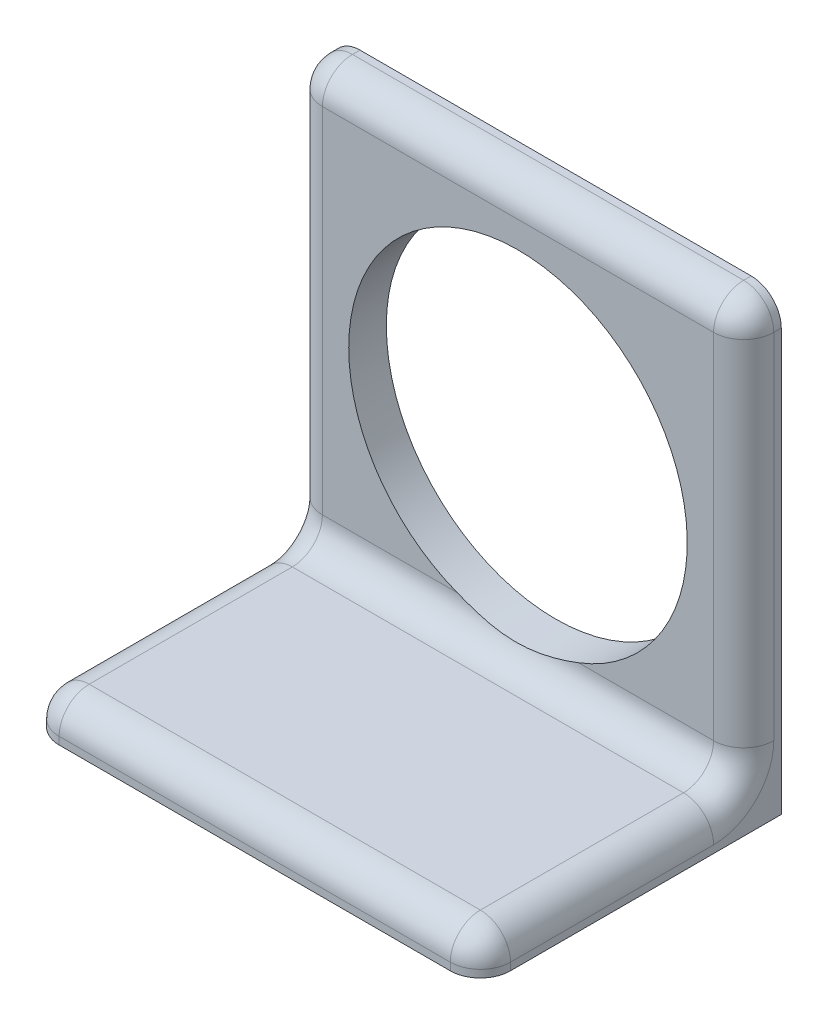
ISO-10303-21;
HEADER;
FILE_DESCRIPTION(('STEP AP214'),'2;1');
FILE_NAME('part.step','',(''),(''),'','','');
FILE_SCHEMA(('AUTOMOTIVE_DESIGN { 1 0 10303 214 1 1 1 1 }'));
ENDSEC;
DATA;
#1=APPLICATION_CONTEXT('core data for automotive mechanical design processes');
#2=APPLICATION_PROTOCOL_DEFINITION('international standard','automotive_design',2000,#1);
#3=PRODUCT_CONTEXT('',#1,'mechanical');
#4=PRODUCT('Part','Part','',(#3));
#5=PRODUCT_RELATED_PRODUCT_CATEGORY('part','',(#4));
#6=PRODUCT_DEFINITION_FORMATION('','',#4);
#7=PRODUCT_DEFINITION_CONTEXT('part definition',#1,'design');
#8=PRODUCT_DEFINITION('design','',#6,#7);
#9=PRODUCT_DEFINITION_SHAPE('','',#8);
#10=(LENGTH_UNIT() NAMED_UNIT(*) SI_UNIT(.MILLI.,.METRE.));
#11=(NAMED_UNIT(*) PLANE_ANGLE_UNIT() SI_UNIT($,.RADIAN.));
#12=(NAMED_UNIT(*) SI_UNIT($,.STERADIAN.) SOLID_ANGLE_UNIT());
#13=UNCERTAINTY_MEASURE_WITH_UNIT(LENGTH_MEASURE(1.E-05),#10,'distance_accuracy_value','');
#14=(GEOMETRIC_REPRESENTATION_CONTEXT(3) GLOBAL_UNCERTAINTY_ASSIGNED_CONTEXT((#13)) GLOBAL_UNIT_ASSIGNED_CONTEXT((#10,
#11,#12)) REPRESENTATION_CONTEXT('',''));
#15=CARTESIAN_POINT('',(0.,0.,0.));
#16=DIRECTION('',(0.,0.,1.));
#17=DIRECTION('',(1.,0.,0.));
#18=AXIS2_PLACEMENT_3D('',#15,#16,#17);
#19=CARTESIAN_POINT('',(0.,0.,3.175));
#20=DIRECTION('',(0.,0.,-1.));
#21=DIRECTION('',(-1.,0.,0.));
#22=AXIS2_PLACEMENT_3D('',#19,#20,#21);
#23=PLANE('',#22);
#24=DIRECTION('',(-1.,0.,0.));
#25=VECTOR('',#24,1.);
#26=CARTESIAN_POINT('',(38.1,5.715,3.175));
#27=LINE('',#26,#25);
#28=CARTESIAN_POINT('',(2.54,5.715,3.175));
#29=VERTEX_POINT('',#28);
#30=CARTESIAN_POINT('',(13.9206305212044,5.715,3.175));
#31=VERTEX_POINT('',#30);
#32=EDGE_CURVE('E157',#29,#31,#27,.F.);
#33=ORIENTED_EDGE('',*,*,#32,.T.);
#34=CARTESIAN_POINT('',(19.05,19.05,3.175));
#35=DIRECTION('',(0.,0.,-1.));
#36=DIRECTION('',(-1.,0.,0.));
#37=AXIS2_PLACEMENT_3D('',#34,#35,#36);
#38=CIRCLE('',#37,14.2875);
#39=CARTESIAN_POINT('',(24.1793694787956,5.715,3.175));
#40=VERTEX_POINT('',#39);
#41=EDGE_CURVE('E52',#31,#40,#38,.T.);
#42=ORIENTED_EDGE('',*,*,#41,.T.);
#43=CARTESIAN_POINT('',(35.56,5.715,3.175));
#44=VERTEX_POINT('',#43);
#45=EDGE_CURVE('E155',#40,#44,#27,.F.);
#46=ORIENTED_EDGE('',*,*,#45,.T.);
#47=DIRECTION('',(0.,1.,0.));
#48=VECTOR('',#47,1.);
#49=CARTESIAN_POINT('',(35.56,0.,3.175));
#50=LINE('',#49,#48);
#51=CARTESIAN_POINT('',(35.56,35.56,3.175));
#52=VERTEX_POINT('',#51);
#53=EDGE_CURVE('E165',#44,#52,#50,.T.);
#54=ORIENTED_EDGE('',*,*,#53,.T.);
#55=DIRECTION('',(-1.,0.,0.));
#56=VECTOR('',#55,1.);
#57=CARTESIAN_POINT('',(0.,35.56,3.175));
#58=LINE('',#57,#56);
#59=CARTESIAN_POINT('',(2.54,35.56,3.175));
#60=VERTEX_POINT('',#59);
#61=EDGE_CURVE('E295',#52,#60,#58,.T.);
#62=ORIENTED_EDGE('',*,*,#61,.T.);
#63=DIRECTION('',(0.,-1.,0.));
#64=VECTOR('',#63,1.);
#65=CARTESIAN_POINT('',(2.54,0.,3.175));
#66=LINE('',#65,#64);
#67=EDGE_CURVE('E168',#60,#29,#66,.T.);
#68=ORIENTED_EDGE('',*,*,#67,.T.);
#69=EDGE_LOOP('',(#33,#42,#46,#54,#62,#68));
#70=FACE_BOUND('',#69,.T.);
#71=ADVANCED_FACE('F33',(#70),#23,.F.);
#72=CARTESIAN_POINT('',(0.,0.,3.175));
#73=DIRECTION('',(1.,0.,0.));
#74=DIRECTION('',(0.,0.,-1.));
#75=AXIS2_PLACEMENT_3D('',#72,#73,#74);
#76=PLANE('',#75);
#77=DIRECTION('',(0.,-1.,0.));
#78=VECTOR('',#77,1.);
#79=CARTESIAN_POINT('',(0.,0.,0.635));
#80=LINE('',#79,#78);
#81=CARTESIAN_POINT('',(0.,5.715,0.635));
#82=VERTEX_POINT('',#81);
#83=CARTESIAN_POINT('',(0.,35.56,0.635));
#84=VERTEX_POINT('',#83);
#85=EDGE_CURVE('E190',#82,#84,#80,.F.);
#86=ORIENTED_EDGE('',*,*,#85,.T.);
#87=DIRECTION('',(0.,0.,-1.));
#88=VECTOR('',#87,1.);
#89=CARTESIAN_POINT('',(0.,35.56,3.175));
#90=LINE('',#89,#88);
#91=CARTESIAN_POINT('',(0.,35.56,0.));
#92=VERTEX_POINT('',#91);
#93=EDGE_CURVE('E192',#84,#92,#90,.T.);
#94=ORIENTED_EDGE('',*,*,#93,.T.);
#95=DIRECTION('',(0.,-1.,0.));
#96=VECTOR('',#95,1.);
#97=CARTESIAN_POINT('',(0.,0.,0.));
#98=LINE('',#97,#96);
#99=CARTESIAN_POINT('',(0.,0.,0.));
#100=VERTEX_POINT('',#99);
#101=EDGE_CURVE('E274',#92,#100,#98,.T.);
#102=ORIENTED_EDGE('',*,*,#101,.T.);
#103=DIRECTION('',(0.,0.,-1.));
#104=VECTOR('',#103,1.);
#105=CARTESIAN_POINT('',(0.,0.,3.175));
#106=LINE('',#105,#104);
#107=CARTESIAN_POINT('',(0.,0.,22.86));
#108=VERTEX_POINT('',#107);
#109=EDGE_CURVE('E293',#108,#100,#106,.T.);
#110=ORIENTED_EDGE('',*,*,#109,.F.);
#111=DIRECTION('',(0.,-1.,0.));
#112=VECTOR('',#111,1.);
#113=CARTESIAN_POINT('',(0.,0.,22.86));
#114=LINE('',#113,#112);
#115=CARTESIAN_POINT('',(0.,0.635,22.86));
#116=VERTEX_POINT('',#115);
#117=EDGE_CURVE('E183',#108,#116,#114,.F.);
#118=ORIENTED_EDGE('',*,*,#117,.T.);
#119=DIRECTION('',(0.,0.,-1.));
#120=VECTOR('',#119,1.);
#121=CARTESIAN_POINT('',(0.,0.635,3.175));
#122=LINE('',#121,#120);
#123=CARTESIAN_POINT('',(0.,0.635,5.715));
#124=VERTEX_POINT('',#123);
#125=EDGE_CURVE('E185',#116,#124,#122,.T.);
#126=ORIENTED_EDGE('',*,*,#125,.T.);
#127=CARTESIAN_POINT('',(0.,5.715,5.715));
#128=DIRECTION('',(1.,0.,0.));
#129=DIRECTION('',(0.,0.,-1.));
#130=AXIS2_PLACEMENT_3D('',#127,#128,#129);
#131=CIRCLE('',#130,5.08);
#132=EDGE_CURVE('E187',#82,#124,#131,.F.);
#133=ORIENTED_EDGE('',*,*,#132,.F.);
#134=EDGE_LOOP('',(#86,#94,#102,#110,#118,#126,#133));
#135=FACE_BOUND('',#134,.T.);
#136=ADVANCED_FACE('F341',(#135),#76,.F.);
#137=CARTESIAN_POINT('',(0.,0.,3.175));
#138=DIRECTION('',(0.,1.,0.));
#139=DIRECTION('',(0.,0.,1.));
#140=AXIS2_PLACEMENT_3D('',#137,#138,#139);
#141=PLANE('',#140);
#142=DIRECTION('',(1.,0.,0.));
#143=VECTOR('',#142,1.);
#144=CARTESIAN_POINT('',(0.,0.,25.4));
#145=LINE('',#144,#143);
#146=CARTESIAN_POINT('',(2.54,0.,25.4));
#147=VERTEX_POINT('',#146);
#148=CARTESIAN_POINT('',(35.56,0.,25.4));
#149=VERTEX_POINT('',#148);
#150=EDGE_CURVE('E268',#147,#149,#145,.T.);
#151=ORIENTED_EDGE('',*,*,#150,.F.);
#152=CARTESIAN_POINT('',(2.54,0.,22.86));
#153=DIRECTION('',(0.,1.,0.));
#154=DIRECTION('',(0.,0.,1.));
#155=AXIS2_PLACEMENT_3D('',#152,#153,#154);
#156=CIRCLE('',#155,2.54);
#157=EDGE_CURVE('E46',#147,#108,#156,.F.);
#158=ORIENTED_EDGE('',*,*,#157,.T.);
#159=ORIENTED_EDGE('',*,*,#109,.T.);
#160=DIRECTION('',(1.,0.,0.));
#161=VECTOR('',#160,1.);
#162=CARTESIAN_POINT('',(0.,0.,0.));
#163=LINE('',#162,#161);
#164=CARTESIAN_POINT('',(38.1,0.,0.));
#165=VERTEX_POINT('',#164);
#166=EDGE_CURVE('E280',#100,#165,#163,.T.);
#167=ORIENTED_EDGE('',*,*,#166,.T.);
#168=DIRECTION('',(0.,0.,-1.));
#169=VECTOR('',#168,1.);
#170=CARTESIAN_POINT('',(38.1,0.,3.175));
#171=LINE('',#170,#169);
#172=CARTESIAN_POINT('',(38.1,0.,22.86));
#173=VERTEX_POINT('',#172);
#174=EDGE_CURVE('E291',#173,#165,#171,.T.);
#175=ORIENTED_EDGE('',*,*,#174,.F.);
#176=CARTESIAN_POINT('',(35.56,0.,22.86));
#177=DIRECTION('',(0.,1.,0.));
#178=DIRECTION('',(0.,0.,1.));
#179=AXIS2_PLACEMENT_3D('',#176,#177,#178);
#180=CIRCLE('',#179,2.54);
#181=EDGE_CURVE('E218',#173,#149,#180,.F.);
#182=ORIENTED_EDGE('',*,*,#181,.T.);
#183=EDGE_LOOP('',(#151,#158,#159,#167,#175,#182));
#184=FACE_BOUND('',#183,.T.);
#185=ADVANCED_FACE('F350',(#184),#141,.F.);
#186=CARTESIAN_POINT('',(38.1,0.,3.175));
#187=DIRECTION('',(-1.,0.,0.));
#188=DIRECTION('',(0.,0.,1.));
#189=AXIS2_PLACEMENT_3D('',#186,#187,#188);
#190=PLANE('',#189);
#191=DIRECTION('',(0.,1.,0.));
#192=VECTOR('',#191,1.);
#193=CARTESIAN_POINT('',(38.1,0.,0.));
#194=LINE('',#193,#192);
#195=CARTESIAN_POINT('',(38.1,35.56,0.));
#196=VERTEX_POINT('',#195);
#197=EDGE_CURVE('E286',#165,#196,#194,.T.);
#198=ORIENTED_EDGE('',*,*,#197,.T.);
#199=DIRECTION('',(0.,0.,-1.));
#200=VECTOR('',#199,1.);
#201=CARTESIAN_POINT('',(38.1,35.56,3.175));
#202=LINE('',#201,#200);
#203=CARTESIAN_POINT('',(38.1,35.56,0.635));
#204=VERTEX_POINT('',#203);
#205=EDGE_CURVE('E181',#196,#204,#202,.F.);
#206=ORIENTED_EDGE('',*,*,#205,.T.);
#207=DIRECTION('',(0.,1.,0.));
#208=VECTOR('',#207,1.);
#209=CARTESIAN_POINT('',(38.1,0.,0.635));
#210=LINE('',#209,#208);
#211=CARTESIAN_POINT('',(38.1,5.715,0.635));
#212=VERTEX_POINT('',#211);
#213=EDGE_CURVE('E178',#204,#212,#210,.F.);
#214=ORIENTED_EDGE('',*,*,#213,.T.);
#215=CARTESIAN_POINT('',(38.1,5.715,5.715));
#216=DIRECTION('',(-1.,0.,0.));
#217=DIRECTION('',(0.,0.,1.));
#218=AXIS2_PLACEMENT_3D('',#215,#216,#217);
#219=CIRCLE('',#218,5.08);
#220=CARTESIAN_POINT('',(38.1,0.635,5.715));
#221=VERTEX_POINT('',#220);
#222=EDGE_CURVE('E175',#221,#212,#219,.F.);
#223=ORIENTED_EDGE('',*,*,#222,.F.);
#224=DIRECTION('',(0.,0.,-1.));
#225=VECTOR('',#224,1.);
#226=CARTESIAN_POINT('',(38.1,0.635,3.175));
#227=LINE('',#226,#225);
#228=CARTESIAN_POINT('',(38.1,0.635,22.86));
#229=VERTEX_POINT('',#228);
#230=EDGE_CURVE('E173',#221,#229,#227,.F.);
#231=ORIENTED_EDGE('',*,*,#230,.T.);
#232=DIRECTION('',(0.,1.,0.));
#233=VECTOR('',#232,1.);
#234=CARTESIAN_POINT('',(38.1,0.,22.86));
#235=LINE('',#234,#233);
#236=EDGE_CURVE('E167',#229,#173,#235,.F.);
#237=ORIENTED_EDGE('',*,*,#236,.T.);
#238=ORIENTED_EDGE('',*,*,#174,.T.);
#239=EDGE_LOOP('',(#198,#206,#214,#223,#231,#237,#238));
#240=FACE_BOUND('',#239,.T.);
#241=ADVANCED_FACE('F387',(#240),#190,.F.);
#242=CARTESIAN_POINT('',(0.,38.1,3.175));
#243=DIRECTION('',(0.,-1.,0.));
#244=DIRECTION('',(0.,0.,-1.));
#245=AXIS2_PLACEMENT_3D('',#242,#243,#244);
#246=PLANE('',#245);
#247=DIRECTION('',(-1.,0.,0.));
#248=VECTOR('',#247,1.);
#249=CARTESIAN_POINT('',(0.,38.1,0.));
#250=LINE('',#249,#248);
#251=CARTESIAN_POINT('',(35.56,38.1,0.));
#252=VERTEX_POINT('',#251);
#253=CARTESIAN_POINT('',(2.54,38.1,0.));
#254=VERTEX_POINT('',#253);
#255=EDGE_CURVE('E289',#252,#254,#250,.T.);
#256=ORIENTED_EDGE('',*,*,#255,.T.);
#257=DIRECTION('',(0.,0.,-1.));
#258=VECTOR('',#257,1.);
#259=CARTESIAN_POINT('',(2.54,38.1,3.175));
#260=LINE('',#259,#258);
#261=CARTESIAN_POINT('',(2.54,38.1,0.635));
#262=VERTEX_POINT('',#261);
#263=EDGE_CURVE('E59',#254,#262,#260,.F.);
#264=ORIENTED_EDGE('',*,*,#263,.T.);
#265=DIRECTION('',(-1.,0.,0.));
#266=VECTOR('',#265,1.);
#267=CARTESIAN_POINT('',(0.,38.1,0.635));
#268=LINE('',#267,#266);
#269=CARTESIAN_POINT('',(35.56,38.1,0.635));
#270=VERTEX_POINT('',#269);
#271=EDGE_CURVE('E211',#262,#270,#268,.F.);
#272=ORIENTED_EDGE('',*,*,#271,.T.);
#273=DIRECTION('',(0.,0.,-1.));
#274=VECTOR('',#273,1.);
#275=CARTESIAN_POINT('',(35.56,38.1,3.175));
#276=LINE('',#275,#274);
#277=EDGE_CURVE('E209',#270,#252,#276,.T.);
#278=ORIENTED_EDGE('',*,*,#277,.T.);
#279=EDGE_LOOP('',(#256,#264,#272,#278));
#280=FACE_BOUND('',#279,.T.);
#281=ADVANCED_FACE('F383',(#280),#246,.F.);
#282=CARTESIAN_POINT('',(0.,0.,0.));
#283=DIRECTION('',(0.,0.,-1.));
#284=DIRECTION('',(-1.,0.,0.));
#285=AXIS2_PLACEMENT_3D('',#282,#283,#284);
#286=PLANE('',#285);
#287=CARTESIAN_POINT('',(19.05,19.05,0.));
#288=DIRECTION('',(0.,0.,-1.));
#289=DIRECTION('',(-1.,0.,0.));
#290=AXIS2_PLACEMENT_3D('',#287,#288,#289);
#291=CIRCLE('',#290,14.2875);
#292=CARTESIAN_POINT('',(4.7625,19.05,0.));
#293=VERTEX_POINT('',#292);
#294=EDGE_CURVE('E159',#293,#293,#291,.T.);
#295=ORIENTED_EDGE('',*,*,#294,.F.);
#296=EDGE_LOOP('',(#295));
#297=FACE_BOUND('',#296,.T.);
#298=ORIENTED_EDGE('',*,*,#101,.F.);
#299=CARTESIAN_POINT('',(2.54,35.56,0.));
#300=DIRECTION('',(0.,0.,-1.));
#301=DIRECTION('',(-1.,0.,0.));
#302=AXIS2_PLACEMENT_3D('',#299,#300,#301);
#303=CIRCLE('',#302,2.54);
#304=EDGE_CURVE('E216',#92,#254,#303,.T.);
#305=ORIENTED_EDGE('',*,*,#304,.T.);
#306=ORIENTED_EDGE('',*,*,#255,.F.);
#307=CARTESIAN_POINT('',(35.56,35.56,0.));
#308=DIRECTION('',(0.,0.,-1.));
#309=DIRECTION('',(-1.,0.,0.));
#310=AXIS2_PLACEMENT_3D('',#307,#308,#309);
#311=CIRCLE('',#310,2.54);
#312=EDGE_CURVE('E214',#252,#196,#311,.T.);
#313=ORIENTED_EDGE('',*,*,#312,.T.);
#314=ORIENTED_EDGE('',*,*,#197,.F.);
#315=ORIENTED_EDGE('',*,*,#166,.F.);
#316=EDGE_LOOP('',(#298,#305,#306,#313,#314,#315));
#317=FACE_BOUND('',#316,.T.);
#318=ADVANCED_FACE('F345',(#297,#317),#286,.T.);
#319=CARTESIAN_POINT('',(0.,3.175,25.4));
#320=DIRECTION('',(0.,-1.,0.));
#321=DIRECTION('',(0.,0.,-1.));
#322=AXIS2_PLACEMENT_3D('',#319,#320,#321);
#323=PLANE('',#322);
#324=DIRECTION('',(-1.,0.,0.));
#325=VECTOR('',#324,1.);
#326=CARTESIAN_POINT('',(0.,3.175,22.86));
#327=LINE('',#326,#325);
#328=CARTESIAN_POINT('',(2.54,3.175,22.86));
#329=VERTEX_POINT('',#328);
#330=CARTESIAN_POINT('',(35.56,3.175,22.86));
#331=VERTEX_POINT('',#330);
#332=EDGE_CURVE('E198',#329,#331,#327,.F.);
#333=ORIENTED_EDGE('',*,*,#332,.T.);
#334=DIRECTION('',(0.,0.,-1.));
#335=VECTOR('',#334,1.);
#336=CARTESIAN_POINT('',(35.56,3.175,25.4));
#337=LINE('',#336,#335);
#338=CARTESIAN_POINT('',(35.56,3.175,5.715));
#339=VERTEX_POINT('',#338);
#340=EDGE_CURVE('E200',#331,#339,#337,.T.);
#341=ORIENTED_EDGE('',*,*,#340,.T.);
#342=DIRECTION('',(-1.,0.,0.));
#343=VECTOR('',#342,1.);
#344=CARTESIAN_POINT('',(0.,3.175,5.715));
#345=LINE('',#344,#343);
#346=CARTESIAN_POINT('',(2.54,3.175,5.715));
#347=VERTEX_POINT('',#346);
#348=EDGE_CURVE('E194',#339,#347,#345,.T.);
#349=ORIENTED_EDGE('',*,*,#348,.T.);
#350=DIRECTION('',(0.,0.,-1.));
#351=VECTOR('',#350,1.);
#352=CARTESIAN_POINT('',(2.54,3.175,25.4));
#353=LINE('',#352,#351);
#354=EDGE_CURVE('E196',#347,#329,#353,.F.);
#355=ORIENTED_EDGE('',*,*,#354,.T.);
#356=EDGE_LOOP('',(#333,#341,#349,#355));
#357=FACE_BOUND('',#356,.T.);
#358=ADVANCED_FACE('F310',(#357),#323,.F.);
#359=CARTESIAN_POINT('',(0.,0.,25.4));
#360=DIRECTION('',(0.,0.,-1.));
#361=DIRECTION('',(-1.,0.,0.));
#362=AXIS2_PLACEMENT_3D('',#359,#360,#361);
#363=PLANE('',#362);
#364=DIRECTION('',(-1.,0.,0.));
#365=VECTOR('',#364,1.);
#366=CARTESIAN_POINT('',(0.,0.635,25.4));
#367=LINE('',#366,#365);
#368=CARTESIAN_POINT('',(35.56,0.635,25.4));
#369=VERTEX_POINT('',#368);
#370=CARTESIAN_POINT('',(2.54,0.635,25.4));
#371=VERTEX_POINT('',#370);
#372=EDGE_CURVE('E205',#369,#371,#367,.T.);
#373=ORIENTED_EDGE('',*,*,#372,.T.);
#374=DIRECTION('',(0.,-1.,0.));
#375=VECTOR('',#374,1.);
#376=CARTESIAN_POINT('',(2.54,0.,25.4));
#377=LINE('',#376,#375);
#378=EDGE_CURVE('E207',#371,#147,#377,.T.);
#379=ORIENTED_EDGE('',*,*,#378,.T.);
#380=ORIENTED_EDGE('',*,*,#150,.T.);
#381=DIRECTION('',(0.,1.,0.));
#382=VECTOR('',#381,1.);
#383=CARTESIAN_POINT('',(35.56,0.,25.4));
#384=LINE('',#383,#382);
#385=EDGE_CURVE('E203',#149,#369,#384,.T.);
#386=ORIENTED_EDGE('',*,*,#385,.T.);
#387=EDGE_LOOP('',(#373,#379,#380,#386));
#388=FACE_BOUND('',#387,.T.);
#389=ADVANCED_FACE('F485',(#388),#363,.F.);
#390=CARTESIAN_POINT('',(2.54,0.,22.86));
#391=DIRECTION('',(0.,-1.,0.));
#392=DIRECTION('',(0.,0.,-1.));
#393=AXIS2_PLACEMENT_3D('',#390,#391,#392);
#394=CYLINDRICAL_SURFACE('',#393,2.54);
#395=CARTESIAN_POINT('',(2.54,0.635,22.86));
#396=DIRECTION('',(0.,1.,0.));
#397=DIRECTION('',(0.,0.,1.));
#398=AXIS2_PLACEMENT_3D('',#395,#396,#397);
#399=CIRCLE('',#398,2.54);
#400=EDGE_CURVE('E266',#116,#371,#399,.T.);
#401=ORIENTED_EDGE('',*,*,#400,.F.);
#402=ORIENTED_EDGE('',*,*,#117,.F.);
#403=ORIENTED_EDGE('',*,*,#157,.F.);
#404=ORIENTED_EDGE('',*,*,#378,.F.);
#405=EDGE_LOOP('',(#401,#402,#403,#404));
#406=FACE_BOUND('',#405,.T.);
#407=ADVANCED_FACE('F35',(#406),#394,.T.);
#408=CARTESIAN_POINT('',(2.54,0.635,22.86));
#409=DIRECTION('',(0.,0.,1.));
#410=DIRECTION('',(1.,0.,0.));
#411=AXIS2_PLACEMENT_3D('',#408,#409,#410);
#412=SPHERICAL_SURFACE('',#411,2.54);
#413=CARTESIAN_POINT('',(2.54,0.635,22.86));
#414=DIRECTION('',(0.,0.,1.));
#415=DIRECTION('',(1.,0.,0.));
#416=AXIS2_PLACEMENT_3D('',#413,#414,#415);
#417=CIRCLE('',#416,2.54);
#418=EDGE_CURVE('E261',#116,#329,#417,.F.);
#419=ORIENTED_EDGE('',*,*,#418,.F.);
#420=ORIENTED_EDGE('',*,*,#400,.T.);
#421=CARTESIAN_POINT('',(2.54,0.635,22.86));
#422=DIRECTION('',(-1.,0.,0.));
#423=DIRECTION('',(0.,0.,1.));
#424=AXIS2_PLACEMENT_3D('',#421,#422,#423);
#425=CIRCLE('',#424,2.54);
#426=EDGE_CURVE('E264',#329,#371,#425,.F.);
#427=ORIENTED_EDGE('',*,*,#426,.F.);
#428=EDGE_LOOP('',(#419,#420,#427));
#429=FACE_BOUND('',#428,.T.);
#430=ADVANCED_FACE('F357',(#429),#412,.T.);
#431=CARTESIAN_POINT('',(35.56,0.,22.86));
#432=DIRECTION('',(0.,1.,0.));
#433=DIRECTION('',(0.,0.,1.));
#434=AXIS2_PLACEMENT_3D('',#431,#432,#433);
#435=CYLINDRICAL_SURFACE('',#434,2.54);
#436=ORIENTED_EDGE('',*,*,#181,.F.);
#437=ORIENTED_EDGE('',*,*,#236,.F.);
#438=CARTESIAN_POINT('',(35.56,0.635,22.86));
#439=DIRECTION('',(0.,1.,0.));
#440=DIRECTION('',(0.,0.,1.));
#441=AXIS2_PLACEMENT_3D('',#438,#439,#440);
#442=CIRCLE('',#441,2.54);
#443=EDGE_CURVE('E258',#369,#229,#442,.T.);
#444=ORIENTED_EDGE('',*,*,#443,.F.);
#445=ORIENTED_EDGE('',*,*,#385,.F.);
#446=EDGE_LOOP('',(#436,#437,#444,#445));
#447=FACE_BOUND('',#446,.T.);
#448=ADVANCED_FACE('F368',(#447),#435,.T.);
#449=CARTESIAN_POINT('',(0.,0.635,22.86));
#450=DIRECTION('',(-1.,0.,0.));
#451=DIRECTION('',(0.,0.,1.));
#452=AXIS2_PLACEMENT_3D('',#449,#450,#451);
#453=CYLINDRICAL_SURFACE('',#452,2.54);
#454=ORIENTED_EDGE('',*,*,#426,.T.);
#455=ORIENTED_EDGE('',*,*,#372,.F.);
#456=CARTESIAN_POINT('',(35.56,0.635,22.86));
#457=DIRECTION('',(1.,0.,0.));
#458=DIRECTION('',(0.,0.,-1.));
#459=AXIS2_PLACEMENT_3D('',#456,#457,#458);
#460=CIRCLE('',#459,2.54);
#461=EDGE_CURVE('E255',#331,#369,#460,.T.);
#462=ORIENTED_EDGE('',*,*,#461,.F.);
#463=ORIENTED_EDGE('',*,*,#332,.F.);
#464=EDGE_LOOP('',(#454,#455,#462,#463));
#465=FACE_BOUND('',#464,.T.);
#466=ADVANCED_FACE('F361',(#465),#453,.T.);
#467=CARTESIAN_POINT('',(2.54,0.635,3.175));
#468=DIRECTION('',(0.,0.,-1.));
#469=DIRECTION('',(-1.,0.,0.));
#470=AXIS2_PLACEMENT_3D('',#467,#468,#469);
#471=CYLINDRICAL_SURFACE('',#470,2.54);
#472=ORIENTED_EDGE('',*,*,#418,.T.);
#473=ORIENTED_EDGE('',*,*,#354,.F.);
#474=CARTESIAN_POINT('',(2.54,0.635,5.715));
#475=DIRECTION('',(0.,0.,-1.));
#476=DIRECTION('',(-1.,0.,0.));
#477=AXIS2_PLACEMENT_3D('',#474,#475,#476);
#478=CIRCLE('',#477,2.54);
#479=EDGE_CURVE('E252',#124,#347,#478,.T.);
#480=ORIENTED_EDGE('',*,*,#479,.F.);
#481=ORIENTED_EDGE('',*,*,#125,.F.);
#482=EDGE_LOOP('',(#472,#473,#480,#481));
#483=FACE_BOUND('',#482,.T.);
#484=ADVANCED_FACE('F359',(#483),#471,.T.);
#485=CARTESIAN_POINT('',(2.54,0.,0.635));
#486=DIRECTION('',(0.,-1.,0.));
#487=DIRECTION('',(0.,0.,-1.));
#488=AXIS2_PLACEMENT_3D('',#485,#486,#487);
#489=CYLINDRICAL_SURFACE('',#488,2.54);
#490=CARTESIAN_POINT('',(2.54,35.56,0.635));
#491=DIRECTION('',(0.,1.,0.));
#492=DIRECTION('',(0.,0.,1.));
#493=AXIS2_PLACEMENT_3D('',#490,#491,#492);
#494=CIRCLE('',#493,2.54);
#495=EDGE_CURVE('E246',#84,#60,#494,.T.);
#496=ORIENTED_EDGE('',*,*,#495,.F.);
#497=ORIENTED_EDGE('',*,*,#85,.F.);
#498=CARTESIAN_POINT('',(2.54,5.715,0.635));
#499=DIRECTION('',(0.,-1.,0.));
#500=DIRECTION('',(0.,0.,-1.));
#501=AXIS2_PLACEMENT_3D('',#498,#499,#500);
#502=CIRCLE('',#501,2.54);
#503=EDGE_CURVE('E249',#29,#82,#502,.T.);
#504=ORIENTED_EDGE('',*,*,#503,.F.);
#505=ORIENTED_EDGE('',*,*,#67,.F.);
#506=EDGE_LOOP('',(#496,#497,#504,#505));
#507=FACE_BOUND('',#506,.T.);
#508=ADVANCED_FACE('F303',(#507),#489,.T.);
#509=CARTESIAN_POINT('',(2.54,35.56,3.175));
#510=DIRECTION('',(0.,0.,-1.));
#511=DIRECTION('',(-1.,0.,0.));
#512=AXIS2_PLACEMENT_3D('',#509,#510,#511);
#513=CYLINDRICAL_SURFACE('',#512,2.54);
#514=ORIENTED_EDGE('',*,*,#304,.F.);
#515=ORIENTED_EDGE('',*,*,#93,.F.);
#516=CARTESIAN_POINT('',(2.54,35.56,0.635));
#517=DIRECTION('',(0.,0.,1.));
#518=DIRECTION('',(1.,0.,0.));
#519=AXIS2_PLACEMENT_3D('',#516,#517,#518);
#520=CIRCLE('',#519,2.54);
#521=EDGE_CURVE('E243',#262,#84,#520,.T.);
#522=ORIENTED_EDGE('',*,*,#521,.F.);
#523=ORIENTED_EDGE('',*,*,#263,.F.);
#524=EDGE_LOOP('',(#514,#515,#522,#523));
#525=FACE_BOUND('',#524,.T.);
#526=ADVANCED_FACE('F338',(#525),#513,.T.);
#527=CARTESIAN_POINT('',(35.56,0.635,22.86));
#528=DIRECTION('',(0.,0.,1.));
#529=DIRECTION('',(1.,0.,0.));
#530=AXIS2_PLACEMENT_3D('',#527,#528,#529);
#531=SPHERICAL_SURFACE('',#530,2.54);
#532=ORIENTED_EDGE('',*,*,#461,.T.);
#533=ORIENTED_EDGE('',*,*,#443,.T.);
#534=CARTESIAN_POINT('',(35.56,0.635,22.86));
#535=DIRECTION('',(0.,0.,1.));
#536=DIRECTION('',(1.,0.,0.));
#537=AXIS2_PLACEMENT_3D('',#534,#535,#536);
#538=CIRCLE('',#537,2.54);
#539=EDGE_CURVE('E240',#331,#229,#538,.F.);
#540=ORIENTED_EDGE('',*,*,#539,.F.);
#541=EDGE_LOOP('',(#532,#533,#540));
#542=FACE_BOUND('',#541,.T.);
#543=ADVANCED_FACE('F413',(#542),#531,.T.);
#544=CARTESIAN_POINT('',(2.54,5.715,5.715));
#545=DIRECTION('',(1.,0.,0.));
#546=DIRECTION('',(0.,0.,-1.));
#547=AXIS2_PLACEMENT_3D('',#544,#545,#546);
#548=TOROIDAL_SURFACE('',#547,5.08,2.54);
#549=ORIENTED_EDGE('',*,*,#132,.T.);
#550=ORIENTED_EDGE('',*,*,#479,.T.);
#551=CARTESIAN_POINT('',(2.54,5.715,5.715));
#552=DIRECTION('',(1.,0.,0.));
#553=DIRECTION('',(0.,0.,-1.));
#554=AXIS2_PLACEMENT_3D('',#551,#552,#553);
#555=CIRCLE('',#554,2.54);
#556=EDGE_CURVE('E237',#29,#347,#555,.F.);
#557=ORIENTED_EDGE('',*,*,#556,.F.);
#558=ORIENTED_EDGE('',*,*,#503,.T.);
#559=EDGE_LOOP('',(#549,#550,#557,#558));
#560=FACE_BOUND('',#559,.T.);
#561=ADVANCED_FACE('F305',(#560),#548,.T.);
#562=CARTESIAN_POINT('',(2.54,35.56,0.635));
#563=DIRECTION('',(0.,0.,1.));
#564=DIRECTION('',(1.,0.,0.));
#565=AXIS2_PLACEMENT_3D('',#562,#563,#564);
#566=SPHERICAL_SURFACE('',#565,2.54);
#567=ORIENTED_EDGE('',*,*,#521,.T.);
#568=ORIENTED_EDGE('',*,*,#495,.T.);
#569=CARTESIAN_POINT('',(2.54,35.56,0.635));
#570=DIRECTION('',(-1.,0.,0.));
#571=DIRECTION('',(0.,0.,1.));
#572=AXIS2_PLACEMENT_3D('',#569,#570,#571);
#573=CIRCLE('',#572,2.54);
#574=EDGE_CURVE('E234',#262,#60,#573,.F.);
#575=ORIENTED_EDGE('',*,*,#574,.F.);
#576=EDGE_LOOP('',(#567,#568,#575));
#577=FACE_BOUND('',#576,.T.);
#578=ADVANCED_FACE('F334',(#577),#566,.T.);
#579=CARTESIAN_POINT('',(35.56,0.635,25.4));
#580=DIRECTION('',(0.,0.,-1.));
#581=DIRECTION('',(-1.,0.,0.));
#582=AXIS2_PLACEMENT_3D('',#579,#580,#581);
#583=CYLINDRICAL_SURFACE('',#582,2.54);
#584=ORIENTED_EDGE('',*,*,#539,.T.);
#585=ORIENTED_EDGE('',*,*,#230,.F.);
#586=CARTESIAN_POINT('',(35.56,0.635,5.715));
#587=DIRECTION('',(0.,0.,-1.));
#588=DIRECTION('',(-1.,0.,0.));
#589=AXIS2_PLACEMENT_3D('',#586,#587,#588);
#590=CIRCLE('',#589,2.54);
#591=EDGE_CURVE('E231',#339,#221,#590,.T.);
#592=ORIENTED_EDGE('',*,*,#591,.F.);
#593=ORIENTED_EDGE('',*,*,#340,.F.);
#594=EDGE_LOOP('',(#584,#585,#592,#593));
#595=FACE_BOUND('',#594,.T.);
#596=ADVANCED_FACE('F315',(#595),#583,.T.);
#597=CARTESIAN_POINT('',(0.,5.715,5.715));
#598=DIRECTION('',(1.,0.,0.));
#599=DIRECTION('',(0.,0.,-1.));
#600=AXIS2_PLACEMENT_3D('',#597,#598,#599);
#601=CYLINDRICAL_SURFACE('',#600,2.54);
#602=ORIENTED_EDGE('',*,*,#45,.F.);
#603=CARTESIAN_POINT('',(24.1793694787956,5.715,3.175));
#604=CARTESIAN_POINT('',(24.0008151402721,5.64631510972929,3.17503344918519));
#605=CARTESIAN_POINT('',(23.8209136578705,5.58123502020717,3.17778497946981));
#606=CARTESIAN_POINT('',(23.4587772263392,5.45838988475035,3.18723651460034));
#607=CARTESIAN_POINT('',(23.2765428704118,5.40062301835455,3.19393553445111));
#608=CARTESIAN_POINT('',(22.9099760750302,5.29246478143075,3.20979742085815));
#609=CARTESIAN_POINT('',(22.7256432298797,5.24207486409512,3.2189607718595));
#610=CARTESIAN_POINT('',(22.3551531905034,5.14873701468607,3.23846564395176));
#611=CARTESIAN_POINT('',(22.1689958777918,5.1057895693757,3.24880724203078));
#612=CARTESIAN_POINT('',(21.7955695717367,5.02748918365154,3.26948083410856));
#613=CARTESIAN_POINT('',(21.6083044326599,4.99211784621775,3.27981278929292));
#614=CARTESIAN_POINT('',(21.2324588438248,4.92888663306904,3.29948287843032));
#615=CARTESIAN_POINT('',(21.0438784094008,4.90102666993396,3.30882102394893));
#616=CARTESIAN_POINT('',(20.6657220843909,4.85287290551965,3.32565112539439));
#617=CARTESIAN_POINT('',(20.4761464805311,4.83257703448738,3.33314358616313));
#618=CARTESIAN_POINT('',(20.0962507220851,4.79958361876029,3.34562776389316));
#619=CARTESIAN_POINT('',(19.9059305675993,4.78688607304075,3.3506194811917));
#620=CARTESIAN_POINT('',(19.5243197459506,4.76909424836367,3.35768058671331));
#621=CARTESIAN_POINT('',(19.3330278694513,4.76402237640218,3.35974136180963));
#622=CARTESIAN_POINT('',(18.9503863630611,4.76156626974292,3.36073452249118));
#623=CARTESIAN_POINT('',(18.7590367331455,4.76418203831796,3.35966690674458));
#624=CARTESIAN_POINT('',(18.3765851657783,4.77709600355974,3.35449495304332));
#625=CARTESIAN_POINT('',(18.1854833134304,4.78739636727138,3.35038975849844));
#626=CARTESIAN_POINT('',(17.8039259095799,4.81565587385297,3.33949822941544));
#627=CARTESIAN_POINT('',(17.6134703575068,4.83361500995975,3.33271189724494));
#628=CARTESIAN_POINT('',(17.2338836294749,4.87711027151637,3.31706902322025));
#629=CARTESIAN_POINT('',(17.0447506189917,4.90263186238568,3.30821645940519));
#630=CARTESIAN_POINT('',(16.6677012077334,4.96122027661829,3.28922925969676));
#631=CARTESIAN_POINT('',(16.4797849529164,4.99428798855721,3.27909447288095));
#632=CARTESIAN_POINT('',(16.1055514786634,5.06789628445545,3.25851550405106));
#633=CARTESIAN_POINT('',(15.9192333966695,5.10843253209275,3.24807150450784));
#634=CARTESIAN_POINT('',(15.5483284121721,5.19693869469664,3.22797955321194));
#635=CARTESIAN_POINT('',(15.3637415349852,5.2449087181929,3.2183316130845));
#636=CARTESIAN_POINT('',(14.967124089494,5.35650757501362,3.19969064437245));
#637=CARTESIAN_POINT('',(14.7554322426958,5.42141382621288,3.19104989610378));
#638=CARTESIAN_POINT('',(14.440381443565,5.52608406894683,3.18179396769746));
#639=CARTESIAN_POINT('',(14.3358422360611,5.56216830786385,3.17932656965634));
#640=CARTESIAN_POINT('',(14.1275946242458,5.63676710623091,3.17593115547865));
#641=CARTESIAN_POINT('',(14.0238863310264,5.67528198473867,3.1750033418736));
#642=CARTESIAN_POINT('',(13.9206305212044,5.715,3.175));
#643=B_SPLINE_CURVE_WITH_KNOTS('',3,(#603,#604,#605,#606,#607,#608,#609,#610,#611,#612,#613,
#614,#615,#616,#617,#618,#619,#620,#621,#622,#623,#624,#625,#626,#627,#628,#629,#630,#631,#632,
#633,#634,#635,#636,#637,#638,#639,#640,#641,#642),.UNSPECIFIED.,.F.,.F.,(4,2,2,2,2,2,2,2,2,2,2,
2,2,2,2,2,2,2,2,4),(0.,0.573818913232426,1.14749470521548,1.72128335452429,2.29510951741578,
2.86752605454111,3.43993592938165,4.01218906122936,4.58444211590232,5.1583733938143,
5.73230491606238,6.30639834738952,6.8804912717575,7.45348790284015,8.02655204063137,
8.59928449304252,9.17202530786819,9.83648225172307,10.1683047467874,10.5001708894671),.UNSPECIFIED.);
#644=EDGE_CURVE('E11',#40,#31,#643,.T.);
#645=ORIENTED_EDGE('',*,*,#644,.T.);
#646=ORIENTED_EDGE('',*,*,#32,.F.);
#647=ORIENTED_EDGE('',*,*,#556,.T.);
#648=ORIENTED_EDGE('',*,*,#348,.F.);
#649=CARTESIAN_POINT('',(35.56,5.715,5.715));
#650=DIRECTION('',(-1.,0.,0.));
#651=DIRECTION('',(0.,0.,1.));
#652=AXIS2_PLACEMENT_3D('',#649,#650,#651);
#653=CIRCLE('',#652,2.54);
#654=EDGE_CURVE('E163',#44,#339,#653,.T.);
#655=ORIENTED_EDGE('',*,*,#654,.F.);
#656=EDGE_LOOP('',(#602,#645,#646,#647,#648,#655));
#657=FACE_BOUND('',#656,.T.);
#658=ADVANCED_FACE('F161',(#657),#601,.F.);
#659=CARTESIAN_POINT('',(0.,35.56,0.635));
#660=DIRECTION('',(-1.,0.,0.));
#661=DIRECTION('',(0.,0.,1.));
#662=AXIS2_PLACEMENT_3D('',#659,#660,#661);
#663=CYLINDRICAL_SURFACE('',#662,2.54);
#664=ORIENTED_EDGE('',*,*,#574,.T.);
#665=ORIENTED_EDGE('',*,*,#61,.F.);
#666=CARTESIAN_POINT('',(35.56,35.56,0.635));
#667=DIRECTION('',(1.,0.,0.));
#668=DIRECTION('',(0.,0.,-1.));
#669=AXIS2_PLACEMENT_3D('',#666,#667,#668);
#670=CIRCLE('',#669,2.54);
#671=EDGE_CURVE('E227',#270,#52,#670,.T.);
#672=ORIENTED_EDGE('',*,*,#671,.F.);
#673=ORIENTED_EDGE('',*,*,#271,.F.);
#674=EDGE_LOOP('',(#664,#665,#672,#673));
#675=FACE_BOUND('',#674,.T.);
#676=ADVANCED_FACE('F331',(#675),#663,.T.);
#677=CARTESIAN_POINT('',(35.56,35.56,3.175));
#678=DIRECTION('',(0.,0.,-1.));
#679=DIRECTION('',(-1.,0.,0.));
#680=AXIS2_PLACEMENT_3D('',#677,#678,#679);
#681=CYLINDRICAL_SURFACE('',#680,2.54);
#682=ORIENTED_EDGE('',*,*,#312,.F.);
#683=ORIENTED_EDGE('',*,*,#277,.F.);
#684=CARTESIAN_POINT('',(35.56,35.56,0.635));
#685=DIRECTION('',(0.,0.,1.));
#686=DIRECTION('',(1.,0.,0.));
#687=AXIS2_PLACEMENT_3D('',#684,#685,#686);
#688=CIRCLE('',#687,2.54);
#689=EDGE_CURVE('E224',#204,#270,#688,.T.);
#690=ORIENTED_EDGE('',*,*,#689,.F.);
#691=ORIENTED_EDGE('',*,*,#205,.F.);
#692=EDGE_LOOP('',(#682,#683,#690,#691));
#693=FACE_BOUND('',#692,.T.);
#694=ADVANCED_FACE('F399',(#693),#681,.T.);
#695=CARTESIAN_POINT('',(35.56,5.715,5.715));
#696=DIRECTION('',(-1.,0.,0.));
#697=DIRECTION('',(0.,0.,1.));
#698=AXIS2_PLACEMENT_3D('',#695,#696,#697);
#699=TOROIDAL_SURFACE('',#698,5.08,2.54);
#700=ORIENTED_EDGE('',*,*,#591,.T.);
#701=ORIENTED_EDGE('',*,*,#222,.T.);
#702=CARTESIAN_POINT('',(35.56,5.715,0.635));
#703=DIRECTION('',(0.,-1.,0.));
#704=DIRECTION('',(0.,0.,-1.));
#705=AXIS2_PLACEMENT_3D('',#702,#703,#704);
#706=CIRCLE('',#705,2.54);
#707=EDGE_CURVE('E222',#44,#212,#706,.F.);
#708=ORIENTED_EDGE('',*,*,#707,.F.);
#709=ORIENTED_EDGE('',*,*,#654,.T.);
#710=EDGE_LOOP('',(#700,#701,#708,#709));
#711=FACE_BOUND('',#710,.T.);
#712=ADVANCED_FACE('F319',(#711),#699,.T.);
#713=CARTESIAN_POINT('',(35.56,35.56,0.635));
#714=DIRECTION('',(0.,0.,1.));
#715=DIRECTION('',(1.,0.,0.));
#716=AXIS2_PLACEMENT_3D('',#713,#714,#715);
#717=SPHERICAL_SURFACE('',#716,2.54);
#718=ORIENTED_EDGE('',*,*,#689,.T.);
#719=ORIENTED_EDGE('',*,*,#671,.T.);
#720=CARTESIAN_POINT('',(35.56,35.56,0.635));
#721=DIRECTION('',(0.,1.,0.));
#722=DIRECTION('',(0.,0.,1.));
#723=AXIS2_PLACEMENT_3D('',#720,#721,#722);
#724=CIRCLE('',#723,2.54);
#725=EDGE_CURVE('E158',#204,#52,#724,.F.);
#726=ORIENTED_EDGE('',*,*,#725,.F.);
#727=EDGE_LOOP('',(#718,#719,#726));
#728=FACE_BOUND('',#727,.T.);
#729=ADVANCED_FACE('F327',(#728),#717,.T.);
#730=CARTESIAN_POINT('',(35.56,0.,0.635));
#731=DIRECTION('',(0.,1.,0.));
#732=DIRECTION('',(0.,0.,1.));
#733=AXIS2_PLACEMENT_3D('',#730,#731,#732);
#734=CYLINDRICAL_SURFACE('',#733,2.54);
#735=ORIENTED_EDGE('',*,*,#707,.T.);
#736=ORIENTED_EDGE('',*,*,#213,.F.);
#737=ORIENTED_EDGE('',*,*,#725,.T.);
#738=ORIENTED_EDGE('',*,*,#53,.F.);
#739=EDGE_LOOP('',(#735,#736,#737,#738));
#740=FACE_BOUND('',#739,.T.);
#741=ADVANCED_FACE('F323',(#740),#734,.T.);
#742=CARTESIAN_POINT('',(19.05,19.05,25.4));
#743=DIRECTION('',(0.,0.,-1.));
#744=DIRECTION('',(-1.,0.,0.));
#745=AXIS2_PLACEMENT_3D('',#742,#743,#744);
#746=CYLINDRICAL_SURFACE('',#745,14.2875);
#747=ORIENTED_EDGE('',*,*,#294,.T.);
#748=EDGE_LOOP('',(#747));
#749=FACE_BOUND('',#748,.T.);
#750=ORIENTED_EDGE('',*,*,#644,.F.);
#751=ORIENTED_EDGE('',*,*,#41,.F.);
#752=EDGE_LOOP('',(#750,#751));
#753=FACE_BOUND('',#752,.T.);
#754=ADVANCED_FACE('F148',(#749,#753),#746,.F.);
#755=CLOSED_SHELL('',(#71,#136,#185,#241,#281,#318,#358,#389,#407,#430,#448,#466,#484,#508,#526,
#543,#561,#578,#596,#658,#676,#694,#712,#729,#741,#754));
#756=MANIFOLD_SOLID_BREP('B2',#755);
#757=ADVANCED_BREP_SHAPE_REPRESENTATION('',(#18,#756),#14);
#758=SHAPE_DEFINITION_REPRESENTATION(#9,#757);
ENDSEC;
END-ISO-10303-21;
